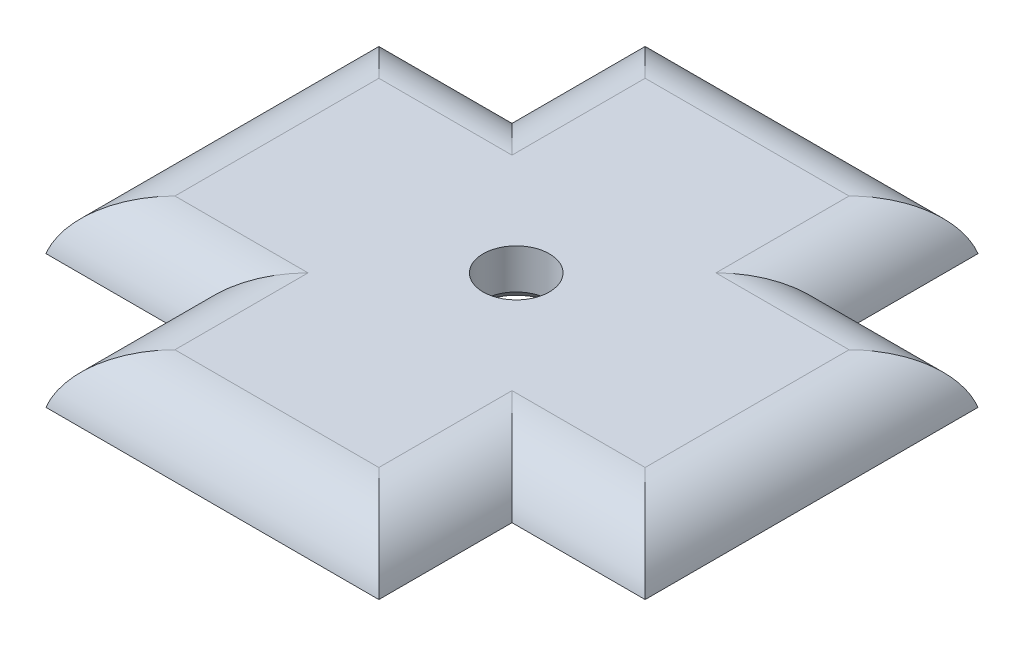
ISO-10303-21;
HEADER;
FILE_DESCRIPTION(('STEP AP214'),'2;1');
FILE_NAME('part.step','',(''),(''),'','','');
FILE_SCHEMA(('AUTOMOTIVE_DESIGN { 1 0 10303 214 1 1 1 1 }'));
ENDSEC;
DATA;
#1=APPLICATION_CONTEXT('core data for automotive mechanical design processes');
#2=APPLICATION_PROTOCOL_DEFINITION('international standard','automotive_design',2000,#1);
#3=PRODUCT_CONTEXT('',#1,'mechanical');
#4=PRODUCT('Part','Part','',(#3));
#5=PRODUCT_RELATED_PRODUCT_CATEGORY('part','',(#4));
#6=PRODUCT_DEFINITION_FORMATION('','',#4);
#7=PRODUCT_DEFINITION_CONTEXT('part definition',#1,'design');
#8=PRODUCT_DEFINITION('design','',#6,#7);
#9=PRODUCT_DEFINITION_SHAPE('','',#8);
#10=(LENGTH_UNIT() NAMED_UNIT(*) SI_UNIT(.MILLI.,.METRE.));
#11=(NAMED_UNIT(*) PLANE_ANGLE_UNIT() SI_UNIT($,.RADIAN.));
#12=(NAMED_UNIT(*) SI_UNIT($,.STERADIAN.) SOLID_ANGLE_UNIT());
#13=UNCERTAINTY_MEASURE_WITH_UNIT(LENGTH_MEASURE(1.E-05),#10,'distance_accuracy_value','');
#14=(GEOMETRIC_REPRESENTATION_CONTEXT(3) GLOBAL_UNCERTAINTY_ASSIGNED_CONTEXT((#13)) GLOBAL_UNIT_ASSIGNED_CONTEXT((#10,
#11,#12)) REPRESENTATION_CONTEXT('',''));
#15=CARTESIAN_POINT('',(0.,0.,0.));
#16=DIRECTION('',(0.,0.,1.));
#17=DIRECTION('',(1.,0.,0.));
#18=AXIS2_PLACEMENT_3D('',#15,#16,#17);
#19=CARTESIAN_POINT('',(0.,7.5,0.));
#20=DIRECTION('',(0.,1.,0.));
#21=DIRECTION('',(0.,0.,1.));
#22=AXIS2_PLACEMENT_3D('',#19,#20,#21);
#23=PLANE('',#22);
#24=CARTESIAN_POINT('',(45.3175416344815,7.5,44.6824583655185));
#25=DIRECTION('',(0.,1.,0.));
#26=DIRECTION('',(0.,0.,1.));
#27=AXIS2_PLACEMENT_3D('',#24,#25,#26);
#28=CIRCLE('',#27,4.975);
#29=CARTESIAN_POINT('',(45.3175416344815,7.5,49.6574583655186));
#30=VERTEX_POINT('',#29);
#31=EDGE_CURVE('E163',#30,#30,#28,.T.);
#32=ORIENTED_EDGE('',*,*,#31,.F.);
#33=EDGE_LOOP('',(#32));
#34=FACE_BOUND('',#33,.T.);
#35=DIRECTION('',(-1.,0.,0.));
#36=VECTOR('',#35,1.);
#37=CARTESIAN_POINT('',(70.,7.5,80.3175416344815));
#38=LINE('',#37,#36);
#39=CARTESIAN_POINT('',(29.6824583655186,7.5,80.3175416344815));
#40=VERTEX_POINT('',#39);
#41=CARTESIAN_POINT('',(60.3175416344814,7.5,80.3175416344815));
#42=VERTEX_POINT('',#41);
#43=EDGE_CURVE('E64',#40,#42,#38,.F.);
#44=ORIENTED_EDGE('',*,*,#43,.T.);
#45=DIRECTION('',(0.,0.,1.));
#46=VECTOR('',#45,1.);
#47=CARTESIAN_POINT('',(60.3175416344814,7.5,70.));
#48=LINE('',#47,#46);
#49=CARTESIAN_POINT('',(60.3175416344815,7.5,60.3175416344815));
#50=VERTEX_POINT('',#49);
#51=EDGE_CURVE('E59',#42,#50,#48,.F.);
#52=ORIENTED_EDGE('',*,*,#51,.T.);
#53=DIRECTION('',(1.,0.,0.));
#54=VECTOR('',#53,1.);
#55=CARTESIAN_POINT('',(90.,7.5,60.3175416344814));
#56=LINE('',#55,#54);
#57=CARTESIAN_POINT('',(80.3175416344815,7.5,60.3175416344814));
#58=VERTEX_POINT('',#57);
#59=EDGE_CURVE('E228',#50,#58,#56,.T.);
#60=ORIENTED_EDGE('',*,*,#59,.T.);
#61=DIRECTION('',(0.,0.,-1.));
#62=VECTOR('',#61,1.);
#63=CARTESIAN_POINT('',(80.3175416344815,7.5,20.));
#64=LINE('',#63,#62);
#65=CARTESIAN_POINT('',(80.3175416344815,7.5,29.6824583655185));
#66=VERTEX_POINT('',#65);
#67=EDGE_CURVE('E223',#58,#66,#64,.T.);
#68=ORIENTED_EDGE('',*,*,#67,.T.);
#69=DIRECTION('',(1.,0.,0.));
#70=VECTOR('',#69,1.);
#71=CARTESIAN_POINT('',(70.,7.5,29.6824583655186));
#72=LINE('',#71,#70);
#73=CARTESIAN_POINT('',(60.3175416344815,7.5,29.6824583655186));
#74=VERTEX_POINT('',#73);
#75=EDGE_CURVE('E217',#66,#74,#72,.F.);
#76=ORIENTED_EDGE('',*,*,#75,.T.);
#77=DIRECTION('',(0.,0.,-1.));
#78=VECTOR('',#77,1.);
#79=CARTESIAN_POINT('',(60.3175416344814,7.5,0.));
#80=LINE('',#79,#78);
#81=CARTESIAN_POINT('',(60.3175416344814,7.5,9.68245836551854));
#82=VERTEX_POINT('',#81);
#83=EDGE_CURVE('E214',#74,#82,#80,.T.);
#84=ORIENTED_EDGE('',*,*,#83,.T.);
#85=DIRECTION('',(-1.,0.,0.));
#86=VECTOR('',#85,1.);
#87=CARTESIAN_POINT('',(20.,7.5,9.68245836551854));
#88=LINE('',#87,#86);
#89=CARTESIAN_POINT('',(29.6824583655185,7.5,9.68245836551854));
#90=VERTEX_POINT('',#89);
#91=EDGE_CURVE('E211',#82,#90,#88,.T.);
#92=ORIENTED_EDGE('',*,*,#91,.T.);
#93=DIRECTION('',(0.,0.,-1.));
#94=VECTOR('',#93,1.);
#95=CARTESIAN_POINT('',(29.6824583655185,7.5,20.));
#96=LINE('',#95,#94);
#97=CARTESIAN_POINT('',(29.6824583655186,7.5,29.6824583655185));
#98=VERTEX_POINT('',#97);
#99=EDGE_CURVE('E204',#90,#98,#96,.F.);
#100=ORIENTED_EDGE('',*,*,#99,.T.);
#101=DIRECTION('',(-1.,0.,0.));
#102=VECTOR('',#101,1.);
#103=CARTESIAN_POINT('',(0.,7.5,29.6824583655185));
#104=LINE('',#103,#102);
#105=CARTESIAN_POINT('',(9.68245836551855,7.5,29.6824583655185));
#106=VERTEX_POINT('',#105);
#107=EDGE_CURVE('E201',#98,#106,#104,.T.);
#108=ORIENTED_EDGE('',*,*,#107,.T.);
#109=DIRECTION('',(0.,0.,-1.));
#110=VECTOR('',#109,1.);
#111=CARTESIAN_POINT('',(9.68245836551855,7.5,70.));
#112=LINE('',#111,#110);
#113=CARTESIAN_POINT('',(9.68245836551855,7.5,60.3175416344815));
#114=VERTEX_POINT('',#113);
#115=EDGE_CURVE('E198',#106,#114,#112,.F.);
#116=ORIENTED_EDGE('',*,*,#115,.T.);
#117=DIRECTION('',(-1.,0.,0.));
#118=VECTOR('',#117,1.);
#119=CARTESIAN_POINT('',(20.,7.5,60.3175416344815));
#120=LINE('',#119,#118);
#121=CARTESIAN_POINT('',(29.6824583655186,7.5,60.3175416344815));
#122=VERTEX_POINT('',#121);
#123=EDGE_CURVE('E207',#114,#122,#120,.F.);
#124=ORIENTED_EDGE('',*,*,#123,.T.);
#125=DIRECTION('',(0.,0.,1.));
#126=VECTOR('',#125,1.);
#127=CARTESIAN_POINT('',(29.6824583655186,7.5,90.));
#128=LINE('',#127,#126);
#129=EDGE_CURVE('E220',#122,#40,#128,.T.);
#130=ORIENTED_EDGE('',*,*,#129,.T.);
#131=EDGE_LOOP('',(#44,#52,#60,#68,#76,#84,#92,#100,#108,#116,#124,#130));
#132=FACE_BOUND('',#131,.T.);
#133=ADVANCED_FACE('F42',(#34,#132),#23,.T.);
#134=CARTESIAN_POINT('',(0.,0.,0.));
#135=DIRECTION('',(0.,1.,0.));
#136=DIRECTION('',(0.,0.,1.));
#137=AXIS2_PLACEMENT_3D('',#134,#135,#136);
#138=PLANE('',#137);
#139=CARTESIAN_POINT('',(45.3175416344815,0.,44.6824583655185));
#140=DIRECTION('',(0.,1.,0.));
#141=DIRECTION('',(0.,0.,1.));
#142=AXIS2_PLACEMENT_3D('',#139,#140,#141);
#143=CIRCLE('',#142,6.47500000000001);
#144=CARTESIAN_POINT('',(45.3175416344815,0.,51.1574583655186));
#145=VERTEX_POINT('',#144);
#146=EDGE_CURVE('E52',#145,#145,#143,.T.);
#147=ORIENTED_EDGE('',*,*,#146,.T.);
#148=EDGE_LOOP('',(#147));
#149=FACE_BOUND('',#148,.T.);
#150=DIRECTION('',(1.,0.,0.));
#151=VECTOR('',#150,1.);
#152=CARTESIAN_POINT('',(0.,0.,90.));
#153=LINE('',#152,#151);
#154=CARTESIAN_POINT('',(20.,0.,90.));
#155=VERTEX_POINT('',#154);
#156=CARTESIAN_POINT('',(70.,0.,90.));
#157=VERTEX_POINT('',#156);
#158=EDGE_CURVE('E134',#155,#157,#153,.T.);
#159=ORIENTED_EDGE('',*,*,#158,.F.);
#160=DIRECTION('',(0.,0.,-1.));
#161=VECTOR('',#160,1.);
#162=CARTESIAN_POINT('',(20.,0.,0.));
#163=LINE('',#162,#161);
#164=CARTESIAN_POINT('',(20.,0.,70.));
#165=VERTEX_POINT('',#164);
#166=EDGE_CURVE('E195',#155,#165,#163,.T.);
#167=ORIENTED_EDGE('',*,*,#166,.T.);
#168=DIRECTION('',(1.,0.,0.));
#169=VECTOR('',#168,1.);
#170=CARTESIAN_POINT('',(0.,0.,70.));
#171=LINE('',#170,#169);
#172=CARTESIAN_POINT('',(0.,0.,70.));
#173=VERTEX_POINT('',#172);
#174=EDGE_CURVE('E191',#173,#165,#171,.T.);
#175=ORIENTED_EDGE('',*,*,#174,.F.);
#176=DIRECTION('',(0.,0.,1.));
#177=VECTOR('',#176,1.);
#178=CARTESIAN_POINT('',(0.,0.,0.));
#179=LINE('',#178,#177);
#180=CARTESIAN_POINT('',(0.,0.,20.));
#181=VERTEX_POINT('',#180);
#182=EDGE_CURVE('E187',#181,#173,#179,.T.);
#183=ORIENTED_EDGE('',*,*,#182,.F.);
#184=DIRECTION('',(1.,0.,0.));
#185=VECTOR('',#184,1.);
#186=CARTESIAN_POINT('',(0.,0.,20.));
#187=LINE('',#186,#185);
#188=CARTESIAN_POINT('',(20.,0.,20.));
#189=VERTEX_POINT('',#188);
#190=EDGE_CURVE('E184',#181,#189,#187,.T.);
#191=ORIENTED_EDGE('',*,*,#190,.T.);
#192=DIRECTION('',(0.,0.,1.));
#193=VECTOR('',#192,1.);
#194=CARTESIAN_POINT('',(20.,0.,0.));
#195=LINE('',#194,#193);
#196=CARTESIAN_POINT('',(20.,0.,0.));
#197=VERTEX_POINT('',#196);
#198=EDGE_CURVE('E180',#197,#189,#195,.T.);
#199=ORIENTED_EDGE('',*,*,#198,.F.);
#200=DIRECTION('',(1.,0.,0.));
#201=VECTOR('',#200,1.);
#202=CARTESIAN_POINT('',(0.,0.,0.));
#203=LINE('',#202,#201);
#204=CARTESIAN_POINT('',(70.,0.,0.));
#205=VERTEX_POINT('',#204);
#206=EDGE_CURVE('E177',#197,#205,#203,.T.);
#207=ORIENTED_EDGE('',*,*,#206,.T.);
#208=DIRECTION('',(0.,0.,1.));
#209=VECTOR('',#208,1.);
#210=CARTESIAN_POINT('',(70.,0.,0.));
#211=LINE('',#210,#209);
#212=CARTESIAN_POINT('',(70.,0.,20.));
#213=VERTEX_POINT('',#212);
#214=EDGE_CURVE('E174',#205,#213,#211,.T.);
#215=ORIENTED_EDGE('',*,*,#214,.T.);
#216=DIRECTION('',(-1.,0.,0.));
#217=VECTOR('',#216,1.);
#218=CARTESIAN_POINT('',(0.,0.,20.));
#219=LINE('',#218,#217);
#220=CARTESIAN_POINT('',(90.,0.,20.));
#221=VERTEX_POINT('',#220);
#222=EDGE_CURVE('E170',#221,#213,#219,.T.);
#223=ORIENTED_EDGE('',*,*,#222,.F.);
#224=DIRECTION('',(0.,0.,1.));
#225=VECTOR('',#224,1.);
#226=CARTESIAN_POINT('',(90.,0.,0.));
#227=LINE('',#226,#225);
#228=CARTESIAN_POINT('',(90.,0.,70.));
#229=VERTEX_POINT('',#228);
#230=EDGE_CURVE('E167',#221,#229,#227,.T.);
#231=ORIENTED_EDGE('',*,*,#230,.T.);
#232=DIRECTION('',(-1.,0.,0.));
#233=VECTOR('',#232,1.);
#234=CARTESIAN_POINT('',(0.,0.,70.));
#235=LINE('',#234,#233);
#236=CARTESIAN_POINT('',(70.,0.,70.));
#237=VERTEX_POINT('',#236);
#238=EDGE_CURVE('E137',#229,#237,#235,.T.);
#239=ORIENTED_EDGE('',*,*,#238,.T.);
#240=DIRECTION('',(0.,0.,-1.));
#241=VECTOR('',#240,1.);
#242=CARTESIAN_POINT('',(70.,0.,0.));
#243=LINE('',#242,#241);
#244=EDGE_CURVE('E130',#157,#237,#243,.T.);
#245=ORIENTED_EDGE('',*,*,#244,.F.);
#246=EDGE_LOOP('',(#159,#167,#175,#183,#191,#199,#207,#215,#223,#231,#239,#245));
#247=FACE_BOUND('',#246,.T.);
#248=ADVANCED_FACE('F132',(#149,#247),#138,.F.);
#249=CARTESIAN_POINT('',(0.,-2.5,29.6824583655186));
#250=DIRECTION('',(-1.,0.,0.));
#251=DIRECTION('',(0.,0.,1.));
#252=AXIS2_PLACEMENT_3D('',#249,#250,#251);
#253=CYLINDRICAL_SURFACE('',#252,10.);
#254=CARTESIAN_POINT('',(80.3175416344815,-2.5,29.6824583655185));
#255=DIRECTION('',(0.707106781186547,0.,0.707106781186547));
#256=DIRECTION('',(-0.707106781186547,0.,0.707106781186547));
#257=AXIS2_PLACEMENT_3D('',#254,#255,#256);
#258=ELLIPSE('',#257,14.142135623731,10.);
#259=EDGE_CURVE('E160',#221,#66,#258,.T.);
#260=ORIENTED_EDGE('',*,*,#259,.F.);
#261=ORIENTED_EDGE('',*,*,#222,.T.);
#262=CARTESIAN_POINT('',(60.3175416344815,-2.5,29.6824583655186));
#263=DIRECTION('',(-0.707106781186548,0.,-0.707106781186547));
#264=DIRECTION('',(-0.707106781186547,0.,0.707106781186548));
#265=AXIS2_PLACEMENT_3D('',#262,#263,#264);
#266=ELLIPSE('',#265,14.1421356237309,10.);
#267=EDGE_CURVE('E156',#74,#213,#266,.T.);
#268=ORIENTED_EDGE('',*,*,#267,.F.);
#269=ORIENTED_EDGE('',*,*,#75,.F.);
#270=EDGE_LOOP('',(#260,#261,#268,#269));
#271=FACE_BOUND('',#270,.T.);
#272=ADVANCED_FACE('F287',(#271),#253,.T.);
#273=CARTESIAN_POINT('',(60.3175416344814,-2.5,0.));
#274=DIRECTION('',(0.,0.,1.));
#275=DIRECTION('',(1.,0.,0.));
#276=AXIS2_PLACEMENT_3D('',#273,#274,#275);
#277=CYLINDRICAL_SURFACE('',#276,10.);
#278=ORIENTED_EDGE('',*,*,#267,.T.);
#279=ORIENTED_EDGE('',*,*,#214,.F.);
#280=CARTESIAN_POINT('',(60.3175416344814,-2.5,9.68245836551854));
#281=DIRECTION('',(0.707106781186548,0.,0.707106781186547));
#282=DIRECTION('',(0.707106781186547,0.,-0.707106781186548));
#283=AXIS2_PLACEMENT_3D('',#280,#281,#282);
#284=ELLIPSE('',#283,14.1421356237309,10.);
#285=EDGE_CURVE('E258',#82,#205,#284,.F.);
#286=ORIENTED_EDGE('',*,*,#285,.F.);
#287=ORIENTED_EDGE('',*,*,#83,.F.);
#288=EDGE_LOOP('',(#278,#279,#286,#287));
#289=FACE_BOUND('',#288,.T.);
#290=ADVANCED_FACE('F325',(#289),#277,.T.);
#291=CARTESIAN_POINT('',(80.3175416344815,-2.5,0.));
#292=DIRECTION('',(0.,0.,1.));
#293=DIRECTION('',(1.,0.,0.));
#294=AXIS2_PLACEMENT_3D('',#291,#292,#293);
#295=CYLINDRICAL_SURFACE('',#294,10.);
#296=ORIENTED_EDGE('',*,*,#259,.T.);
#297=ORIENTED_EDGE('',*,*,#67,.F.);
#298=CARTESIAN_POINT('',(80.3175416344814,-2.5,60.3175416344814));
#299=DIRECTION('',(-0.707106781186547,0.,0.707106781186548));
#300=DIRECTION('',(0.707106781186548,0.,0.707106781186547));
#301=AXIS2_PLACEMENT_3D('',#298,#299,#300);
#302=ELLIPSE('',#301,14.1421356237309,10.);
#303=EDGE_CURVE('E254',#229,#58,#302,.T.);
#304=ORIENTED_EDGE('',*,*,#303,.F.);
#305=ORIENTED_EDGE('',*,*,#230,.F.);
#306=EDGE_LOOP('',(#296,#297,#304,#305));
#307=FACE_BOUND('',#306,.T.);
#308=ADVANCED_FACE('F321',(#307),#295,.T.);
#309=CARTESIAN_POINT('',(0.,-2.5,9.68245836551854));
#310=DIRECTION('',(1.,0.,0.));
#311=DIRECTION('',(0.,0.,-1.));
#312=AXIS2_PLACEMENT_3D('',#309,#310,#311);
#313=CYLINDRICAL_SURFACE('',#312,10.);
#314=ORIENTED_EDGE('',*,*,#285,.T.);
#315=ORIENTED_EDGE('',*,*,#206,.F.);
#316=CARTESIAN_POINT('',(29.6824583655185,-2.5,9.68245836551854));
#317=DIRECTION('',(0.707106781186547,0.,-0.707106781186548));
#318=DIRECTION('',(0.707106781186548,0.,0.707106781186547));
#319=AXIS2_PLACEMENT_3D('',#316,#317,#318);
#320=ELLIPSE('',#319,14.142135623731,10.);
#321=EDGE_CURVE('E250',#90,#197,#320,.F.);
#322=ORIENTED_EDGE('',*,*,#321,.F.);
#323=ORIENTED_EDGE('',*,*,#91,.F.);
#324=EDGE_LOOP('',(#314,#315,#322,#323));
#325=FACE_BOUND('',#324,.T.);
#326=ADVANCED_FACE('F317',(#325),#313,.T.);
#327=CARTESIAN_POINT('',(0.,-2.5,60.3175416344815));
#328=DIRECTION('',(-1.,0.,0.));
#329=DIRECTION('',(0.,0.,1.));
#330=AXIS2_PLACEMENT_3D('',#327,#328,#329);
#331=CYLINDRICAL_SURFACE('',#330,10.);
#332=ORIENTED_EDGE('',*,*,#303,.T.);
#333=ORIENTED_EDGE('',*,*,#59,.F.);
#334=CARTESIAN_POINT('',(60.3175416344815,-2.5,60.3175416344815));
#335=DIRECTION('',(0.707106781186547,0.,-0.707106781186547));
#336=DIRECTION('',(-0.707106781186548,0.,-0.707106781186548));
#337=AXIS2_PLACEMENT_3D('',#334,#335,#336);
#338=ELLIPSE('',#337,14.1421356237309,10.);
#339=EDGE_CURVE('E247',#237,#50,#338,.F.);
#340=ORIENTED_EDGE('',*,*,#339,.F.);
#341=ORIENTED_EDGE('',*,*,#238,.F.);
#342=EDGE_LOOP('',(#332,#333,#340,#341));
#343=FACE_BOUND('',#342,.T.);
#344=ADVANCED_FACE('F313',(#343),#331,.T.);
#345=CARTESIAN_POINT('',(29.6824583655185,-2.5,0.));
#346=DIRECTION('',(0.,0.,1.));
#347=DIRECTION('',(1.,0.,0.));
#348=AXIS2_PLACEMENT_3D('',#345,#346,#347);
#349=CYLINDRICAL_SURFACE('',#348,10.);
#350=ORIENTED_EDGE('',*,*,#321,.T.);
#351=ORIENTED_EDGE('',*,*,#198,.T.);
#352=CARTESIAN_POINT('',(29.6824583655186,-2.5,29.6824583655185));
#353=DIRECTION('',(-0.707106781186547,0.,0.707106781186548));
#354=DIRECTION('',(0.707106781186548,0.,0.707106781186547));
#355=AXIS2_PLACEMENT_3D('',#352,#353,#354);
#356=ELLIPSE('',#355,14.142135623731,10.);
#357=EDGE_CURVE('E148',#98,#189,#356,.T.);
#358=ORIENTED_EDGE('',*,*,#357,.F.);
#359=ORIENTED_EDGE('',*,*,#99,.F.);
#360=EDGE_LOOP('',(#350,#351,#358,#359));
#361=FACE_BOUND('',#360,.T.);
#362=ADVANCED_FACE('F310',(#361),#349,.T.);
#363=CARTESIAN_POINT('',(60.3175416344815,-2.5,0.));
#364=DIRECTION('',(0.,0.,-1.));
#365=DIRECTION('',(-1.,0.,0.));
#366=AXIS2_PLACEMENT_3D('',#363,#364,#365);
#367=CYLINDRICAL_SURFACE('',#366,10.);
#368=ORIENTED_EDGE('',*,*,#339,.T.);
#369=ORIENTED_EDGE('',*,*,#51,.F.);
#370=CARTESIAN_POINT('',(60.3175416344814,-2.5,80.3175416344815));
#371=DIRECTION('',(0.707106781186548,0.,-0.707106781186547));
#372=DIRECTION('',(0.707106781186547,0.,0.707106781186548));
#373=AXIS2_PLACEMENT_3D('',#370,#371,#372);
#374=ELLIPSE('',#373,14.1421356237309,10.);
#375=EDGE_CURVE('E144',#157,#42,#374,.F.);
#376=ORIENTED_EDGE('',*,*,#375,.F.);
#377=ORIENTED_EDGE('',*,*,#244,.T.);
#378=EDGE_LOOP('',(#368,#369,#376,#377));
#379=FACE_BOUND('',#378,.T.);
#380=ADVANCED_FACE('F145',(#379),#367,.T.);
#381=CARTESIAN_POINT('',(0.,-2.5,29.6824583655185));
#382=DIRECTION('',(1.,0.,0.));
#383=DIRECTION('',(0.,0.,-1.));
#384=AXIS2_PLACEMENT_3D('',#381,#382,#383);
#385=CYLINDRICAL_SURFACE('',#384,10.);
#386=ORIENTED_EDGE('',*,*,#357,.T.);
#387=ORIENTED_EDGE('',*,*,#190,.F.);
#388=CARTESIAN_POINT('',(9.68245836551855,-2.5,29.6824583655185));
#389=DIRECTION('',(-0.707106781186547,0.,0.707106781186548));
#390=DIRECTION('',(0.707106781186548,0.,0.707106781186547));
#391=AXIS2_PLACEMENT_3D('',#388,#389,#390);
#392=ELLIPSE('',#391,14.142135623731,10.);
#393=EDGE_CURVE('E149',#106,#181,#392,.T.);
#394=ORIENTED_EDGE('',*,*,#393,.F.);
#395=ORIENTED_EDGE('',*,*,#107,.F.);
#396=EDGE_LOOP('',(#386,#387,#394,#395));
#397=FACE_BOUND('',#396,.T.);
#398=ADVANCED_FACE('F304',(#397),#385,.T.);
#399=CARTESIAN_POINT('',(0.,-2.5,80.3175416344815));
#400=DIRECTION('',(1.,0.,0.));
#401=DIRECTION('',(0.,0.,-1.));
#402=AXIS2_PLACEMENT_3D('',#399,#400,#401);
#403=CYLINDRICAL_SURFACE('',#402,10.);
#404=ORIENTED_EDGE('',*,*,#375,.T.);
#405=ORIENTED_EDGE('',*,*,#43,.F.);
#406=CARTESIAN_POINT('',(29.6824583655186,-2.5,80.3175416344815));
#407=DIRECTION('',(0.707106781186547,0.,0.707106781186547));
#408=DIRECTION('',(0.707106781186547,0.,-0.707106781186547));
#409=AXIS2_PLACEMENT_3D('',#406,#407,#408);
#410=ELLIPSE('',#409,14.1421356237309,10.);
#411=EDGE_CURVE('E153',#155,#40,#410,.F.);
#412=ORIENTED_EDGE('',*,*,#411,.F.);
#413=ORIENTED_EDGE('',*,*,#158,.T.);
#414=EDGE_LOOP('',(#404,#405,#412,#413));
#415=FACE_BOUND('',#414,.T.);
#416=ADVANCED_FACE('F151',(#415),#403,.T.);
#417=CARTESIAN_POINT('',(9.68245836551854,-2.5,0.));
#418=DIRECTION('',(0.,0.,1.));
#419=DIRECTION('',(1.,0.,0.));
#420=AXIS2_PLACEMENT_3D('',#417,#418,#419);
#421=CYLINDRICAL_SURFACE('',#420,10.);
#422=ORIENTED_EDGE('',*,*,#393,.T.);
#423=ORIENTED_EDGE('',*,*,#182,.T.);
#424=CARTESIAN_POINT('',(9.68245836551855,-2.5,60.3175416344815));
#425=DIRECTION('',(0.707106781186548,0.,0.707106781186547));
#426=DIRECTION('',(-0.707106781186547,0.,0.707106781186548));
#427=AXIS2_PLACEMENT_3D('',#424,#425,#426);
#428=ELLIPSE('',#427,14.1421356237309,10.);
#429=EDGE_CURVE('E236',#114,#173,#428,.T.);
#430=ORIENTED_EDGE('',*,*,#429,.F.);
#431=ORIENTED_EDGE('',*,*,#115,.F.);
#432=EDGE_LOOP('',(#422,#423,#430,#431));
#433=FACE_BOUND('',#432,.T.);
#434=ADVANCED_FACE('F297',(#433),#421,.T.);
#435=CARTESIAN_POINT('',(29.6824583655186,-2.5,0.));
#436=DIRECTION('',(0.,0.,-1.));
#437=DIRECTION('',(-1.,0.,0.));
#438=AXIS2_PLACEMENT_3D('',#435,#436,#437);
#439=CYLINDRICAL_SURFACE('',#438,10.);
#440=ORIENTED_EDGE('',*,*,#411,.T.);
#441=ORIENTED_EDGE('',*,*,#129,.F.);
#442=CARTESIAN_POINT('',(29.6824583655186,-2.5,60.3175416344815));
#443=DIRECTION('',(0.707106781186547,0.,0.707106781186547));
#444=DIRECTION('',(0.707106781186547,0.,-0.707106781186547));
#445=AXIS2_PLACEMENT_3D('',#442,#443,#444);
#446=ELLIPSE('',#445,14.1421356237309,10.);
#447=EDGE_CURVE('E233',#165,#122,#446,.F.);
#448=ORIENTED_EDGE('',*,*,#447,.F.);
#449=ORIENTED_EDGE('',*,*,#166,.F.);
#450=EDGE_LOOP('',(#440,#441,#448,#449));
#451=FACE_BOUND('',#450,.T.);
#452=ADVANCED_FACE('F293',(#451),#439,.T.);
#453=CARTESIAN_POINT('',(0.,-2.5,60.3175416344815));
#454=DIRECTION('',(1.,0.,0.));
#455=DIRECTION('',(0.,0.,-1.));
#456=AXIS2_PLACEMENT_3D('',#453,#454,#455);
#457=CYLINDRICAL_SURFACE('',#456,10.);
#458=ORIENTED_EDGE('',*,*,#429,.T.);
#459=ORIENTED_EDGE('',*,*,#174,.T.);
#460=ORIENTED_EDGE('',*,*,#447,.T.);
#461=ORIENTED_EDGE('',*,*,#123,.F.);
#462=EDGE_LOOP('',(#458,#459,#460,#461));
#463=FACE_BOUND('',#462,.T.);
#464=ADVANCED_FACE('F276',(#463),#457,.T.);
#465=CARTESIAN_POINT('',(45.3175416344815,0.,44.6824583655185));
#466=DIRECTION('',(0.,1.,0.));
#467=DIRECTION('',(0.,0.,1.));
#468=AXIS2_PLACEMENT_3D('',#465,#466,#467);
#469=CYLINDRICAL_SURFACE('',#468,4.975);
#470=CARTESIAN_POINT('',(45.3175416344815,1.50000000000004,44.6824583655185));
#471=DIRECTION('',(0.,1.,0.));
#472=DIRECTION('',(0.,0.,1.));
#473=AXIS2_PLACEMENT_3D('',#470,#471,#472);
#474=CIRCLE('',#473,4.975);
#475=CARTESIAN_POINT('',(45.3175416344815,1.50000000000004,49.6574583655186));
#476=VERTEX_POINT('',#475);
#477=EDGE_CURVE('E11',#476,#476,#474,.F.);
#478=ORIENTED_EDGE('',*,*,#477,.T.);
#479=EDGE_LOOP('',(#478));
#480=FACE_BOUND('',#479,.T.);
#481=ORIENTED_EDGE('',*,*,#31,.T.);
#482=EDGE_LOOP('',(#481));
#483=FACE_BOUND('',#482,.T.);
#484=ADVANCED_FACE('F270',(#480,#483),#469,.F.);
#485=CARTESIAN_POINT('',(45.3175416344815,0.,44.6824583655185));
#486=DIRECTION('',(0.,-1.,0.));
#487=DIRECTION('',(0.,0.,-1.));
#488=AXIS2_PLACEMENT_3D('',#485,#486,#487);
#489=CONICAL_SURFACE('',#488,6.47500000000001,0.785398163397439);
#490=ORIENTED_EDGE('',*,*,#477,.F.);
#491=EDGE_LOOP('',(#490));
#492=FACE_BOUND('',#491,.T.);
#493=ORIENTED_EDGE('',*,*,#146,.F.);
#494=EDGE_LOOP('',(#493));
#495=FACE_BOUND('',#494,.T.);
#496=ADVANCED_FACE('F45',(#492,#495),#489,.F.);
#497=CLOSED_SHELL('',(#133,#248,#272,#290,#308,#326,#344,#362,#380,#398,#416,#434,#452,#464,
#484,#496));
#498=MANIFOLD_SOLID_BREP('B2',#497);
#499=ADVANCED_BREP_SHAPE_REPRESENTATION('',(#18,#498),#14);
#500=SHAPE_DEFINITION_REPRESENTATION(#9,#499);
ENDSEC;
END-ISO-10303-21;
